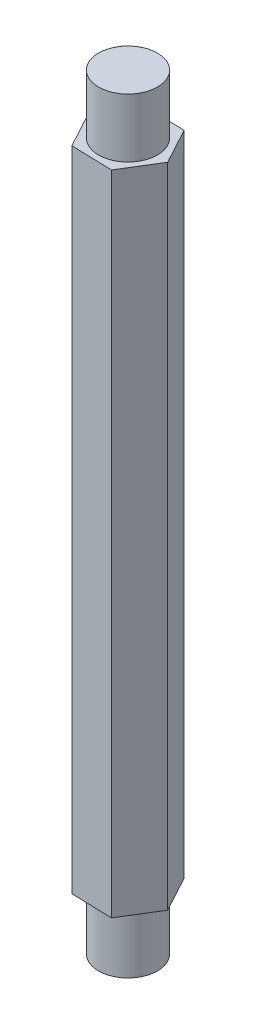
ISO-10303-21;
HEADER;
FILE_DESCRIPTION(('STEP AP214'),'2;1');
FILE_NAME('part.step','',(''),(''),'','','');
FILE_SCHEMA(('AUTOMOTIVE_DESIGN { 1 0 10303 214 1 1 1 1 }'));
ENDSEC;
DATA;
#1=APPLICATION_CONTEXT('core data for automotive mechanical design processes');
#2=APPLICATION_PROTOCOL_DEFINITION('international standard','automotive_design',2000,#1);
#3=PRODUCT_CONTEXT('',#1,'mechanical');
#4=PRODUCT('Part','Part','',(#3));
#5=PRODUCT_RELATED_PRODUCT_CATEGORY('part','',(#4));
#6=PRODUCT_DEFINITION_FORMATION('','',#4);
#7=PRODUCT_DEFINITION_CONTEXT('part definition',#1,'design');
#8=PRODUCT_DEFINITION('design','',#6,#7);
#9=PRODUCT_DEFINITION_SHAPE('','',#8);
#10=(LENGTH_UNIT() NAMED_UNIT(*) SI_UNIT(.MILLI.,.METRE.));
#11=(NAMED_UNIT(*) PLANE_ANGLE_UNIT() SI_UNIT($,.RADIAN.));
#12=(NAMED_UNIT(*) SI_UNIT($,.STERADIAN.) SOLID_ANGLE_UNIT());
#13=UNCERTAINTY_MEASURE_WITH_UNIT(LENGTH_MEASURE(1.E-05),#10,'distance_accuracy_value','');
#14=(GEOMETRIC_REPRESENTATION_CONTEXT(3) GLOBAL_UNCERTAINTY_ASSIGNED_CONTEXT((#13)) GLOBAL_UNIT_ASSIGNED_CONTEXT((#10,
#11,#12)) REPRESENTATION_CONTEXT('',''));
#15=CARTESIAN_POINT('',(0.,0.,0.));
#16=DIRECTION('',(0.,0.,1.));
#17=DIRECTION('',(1.,0.,0.));
#18=AXIS2_PLACEMENT_3D('',#15,#16,#17);
#19=CARTESIAN_POINT('',(0.,36.,0.));
#20=DIRECTION('',(0.,1.,0.));
#21=DIRECTION('',(0.,0.,1.));
#22=AXIS2_PLACEMENT_3D('',#19,#20,#21);
#23=PLANE('',#22);
#24=DIRECTION('',(-0.999619051100166,0.,-0.0275998673475779));
#25=VECTOR('',#24,1.);
#26=CARTESIAN_POINT('',(1.08851435205721,36.,-1.7706316684634));
#27=LINE('',#26,#25);
#28=CARTESIAN_POINT('',(1.08851435205721,36.,-1.7706316684634));
#29=VERTEX_POINT('',#28);
#30=CARTESIAN_POINT('',(-0.989154829605925,36.,-1.8279969154972));
#31=VERTEX_POINT('',#30);
#32=EDGE_CURVE('E131',#29,#31,#27,.T.);
#33=ORIENTED_EDGE('',*,*,#32,.T.);
#34=DIRECTION('',(-0.523711711814166,0.,0.85189555868585));
#35=VECTOR('',#34,1.);
#36=CARTESIAN_POINT('',(-0.989154829605925,36.,-1.8279969154972));
#37=LINE('',#36,#35);
#38=CARTESIAN_POINT('',(-2.07766918166313,36.,-0.0573652470337996));
#39=VERTEX_POINT('',#38);
#40=EDGE_CURVE('E89',#31,#39,#37,.T.);
#41=ORIENTED_EDGE('',*,*,#40,.T.);
#42=DIRECTION('',(0.475907339286,0.,0.879495426033427));
#43=VECTOR('',#42,1.);
#44=CARTESIAN_POINT('',(-2.07766918166313,36.,-0.0573652470337996));
#45=LINE('',#44,#43);
#46=CARTESIAN_POINT('',(-1.0885143520572,36.,1.7706316684634));
#47=VERTEX_POINT('',#46);
#48=EDGE_CURVE('E102',#39,#47,#45,.T.);
#49=ORIENTED_EDGE('',*,*,#48,.T.);
#50=DIRECTION('',(0.999619051100166,0.,0.0275998673475778));
#51=VECTOR('',#50,1.);
#52=CARTESIAN_POINT('',(-1.0885143520572,36.,1.7706316684634));
#53=LINE('',#52,#51);
#54=CARTESIAN_POINT('',(0.989154829605927,36.,1.8279969154972));
#55=VERTEX_POINT('',#54);
#56=EDGE_CURVE('E96',#47,#55,#53,.T.);
#57=ORIENTED_EDGE('',*,*,#56,.T.);
#58=DIRECTION('',(0.523711711814166,0.,-0.85189555868585));
#59=VECTOR('',#58,1.);
#60=CARTESIAN_POINT('',(0.989154829605927,36.,1.8279969154972));
#61=LINE('',#60,#59);
#62=CARTESIAN_POINT('',(2.07766918166313,36.,0.0573652470337994));
#63=VERTEX_POINT('',#62);
#64=EDGE_CURVE('E100',#55,#63,#61,.T.);
#65=ORIENTED_EDGE('',*,*,#64,.T.);
#66=DIRECTION('',(-0.475907339286,0.,-0.879495426033427));
#67=VECTOR('',#66,1.);
#68=CARTESIAN_POINT('',(2.07766918166313,36.,0.0573652470337994));
#69=LINE('',#68,#67);
#70=EDGE_CURVE('E51',#63,#29,#69,.T.);
#71=ORIENTED_EDGE('',*,*,#70,.T.);
#72=EDGE_LOOP('',(#33,#41,#49,#57,#65,#71));
#73=FACE_BOUND('',#72,.T.);
#74=CARTESIAN_POINT('',(0.,36.,0.));
#75=DIRECTION('',(0.,1.,0.));
#76=DIRECTION('',(0.,0.,1.));
#77=AXIS2_PLACEMENT_3D('',#74,#75,#76);
#78=CIRCLE('',#77,1.5);
#79=CARTESIAN_POINT('',(0.,36.,1.5));
#80=VERTEX_POINT('',#79);
#81=EDGE_CURVE('E188',#80,#80,#78,.T.);
#82=ORIENTED_EDGE('',*,*,#81,.F.);
#83=EDGE_LOOP('',(#82));
#84=FACE_BOUND('',#83,.T.);
#85=ADVANCED_FACE('F34',(#73,#84),#23,.T.);
#86=CARTESIAN_POINT('',(0.,3.,0.));
#87=DIRECTION('',(0.,-1.,0.));
#88=DIRECTION('',(0.,0.,-1.));
#89=AXIS2_PLACEMENT_3D('',#86,#87,#88);
#90=CYLINDRICAL_SURFACE('',#89,1.5);
#91=CARTESIAN_POINT('',(0.,3.,0.));
#92=DIRECTION('',(0.,1.,0.));
#93=DIRECTION('',(0.,0.,1.));
#94=AXIS2_PLACEMENT_3D('',#91,#92,#93);
#95=CIRCLE('',#94,1.5);
#96=CARTESIAN_POINT('',(0.,3.,1.5));
#97=VERTEX_POINT('',#96);
#98=EDGE_CURVE('E11',#97,#97,#95,.T.);
#99=ORIENTED_EDGE('',*,*,#98,.F.);
#100=EDGE_LOOP('',(#99));
#101=FACE_BOUND('',#100,.T.);
#102=CARTESIAN_POINT('',(0.,0.,0.));
#103=DIRECTION('',(0.,1.,0.));
#104=DIRECTION('',(0.,0.,1.));
#105=AXIS2_PLACEMENT_3D('',#102,#103,#104);
#106=CIRCLE('',#105,1.5);
#107=CARTESIAN_POINT('',(0.,0.,1.5));
#108=VERTEX_POINT('',#107);
#109=EDGE_CURVE('E38',#108,#108,#106,.T.);
#110=ORIENTED_EDGE('',*,*,#109,.T.);
#111=EDGE_LOOP('',(#110));
#112=FACE_BOUND('',#111,.T.);
#113=ADVANCED_FACE('F36',(#101,#112),#90,.T.);
#114=CARTESIAN_POINT('',(0.,0.,0.));
#115=DIRECTION('',(0.,1.,0.));
#116=DIRECTION('',(0.,0.,1.));
#117=AXIS2_PLACEMENT_3D('',#114,#115,#116);
#118=PLANE('',#117);
#119=ORIENTED_EDGE('',*,*,#109,.F.);
#120=EDGE_LOOP('',(#119));
#121=FACE_BOUND('',#120,.T.);
#122=ADVANCED_FACE('F144',(#121),#118,.F.);
#123=CARTESIAN_POINT('',(0.,3.,0.));
#124=DIRECTION('',(0.,1.,0.));
#125=DIRECTION('',(0.,0.,1.));
#126=AXIS2_PLACEMENT_3D('',#123,#124,#125);
#127=PLANE('',#126);
#128=DIRECTION('',(-0.999619051100166,0.,-0.0275998673475779));
#129=VECTOR('',#128,1.);
#130=CARTESIAN_POINT('',(1.08851435205721,3.,-1.7706316684634));
#131=LINE('',#130,#129);
#132=CARTESIAN_POINT('',(1.08851435205721,3.,-1.7706316684634));
#133=VERTEX_POINT('',#132);
#134=CARTESIAN_POINT('',(-0.989154829605925,3.,-1.8279969154972));
#135=VERTEX_POINT('',#134);
#136=EDGE_CURVE('E120',#133,#135,#131,.T.);
#137=ORIENTED_EDGE('',*,*,#136,.F.);
#138=DIRECTION('',(-0.475907339286,0.,-0.879495426033427));
#139=VECTOR('',#138,1.);
#140=CARTESIAN_POINT('',(2.07766918166313,3.,0.0573652470337994));
#141=LINE('',#140,#139);
#142=CARTESIAN_POINT('',(2.07766918166313,3.,0.0573652470337994));
#143=VERTEX_POINT('',#142);
#144=EDGE_CURVE('E80',#143,#133,#141,.T.);
#145=ORIENTED_EDGE('',*,*,#144,.F.);
#146=DIRECTION('',(0.523711711814166,0.,-0.85189555868585));
#147=VECTOR('',#146,1.);
#148=CARTESIAN_POINT('',(0.989154829605927,3.,1.8279969154972));
#149=LINE('',#148,#147);
#150=CARTESIAN_POINT('',(0.989154829605927,3.,1.8279969154972));
#151=VERTEX_POINT('',#150);
#152=EDGE_CURVE('E74',#151,#143,#149,.T.);
#153=ORIENTED_EDGE('',*,*,#152,.F.);
#154=DIRECTION('',(0.999619051100166,0.,0.0275998673475778));
#155=VECTOR('',#154,1.);
#156=CARTESIAN_POINT('',(-1.0885143520572,3.,1.7706316684634));
#157=LINE('',#156,#155);
#158=CARTESIAN_POINT('',(-1.0885143520572,3.,1.7706316684634));
#159=VERTEX_POINT('',#158);
#160=EDGE_CURVE('E110',#159,#151,#157,.T.);
#161=ORIENTED_EDGE('',*,*,#160,.F.);
#162=DIRECTION('',(0.475907339286,0.,0.879495426033427));
#163=VECTOR('',#162,1.);
#164=CARTESIAN_POINT('',(-2.07766918166313,3.,-0.0573652470337996));
#165=LINE('',#164,#163);
#166=CARTESIAN_POINT('',(-2.07766918166313,3.,-0.0573652470337996));
#167=VERTEX_POINT('',#166);
#168=EDGE_CURVE('E126',#167,#159,#165,.T.);
#169=ORIENTED_EDGE('',*,*,#168,.F.);
#170=DIRECTION('',(-0.523711711814166,0.,0.85189555868585));
#171=VECTOR('',#170,1.);
#172=CARTESIAN_POINT('',(-0.989154829605925,3.,-1.8279969154972));
#173=LINE('',#172,#171);
#174=EDGE_CURVE('E123',#135,#167,#173,.T.);
#175=ORIENTED_EDGE('',*,*,#174,.F.);
#176=EDGE_LOOP('',(#137,#145,#153,#161,#169,#175));
#177=FACE_BOUND('',#176,.T.);
#178=ORIENTED_EDGE('',*,*,#98,.T.);
#179=EDGE_LOOP('',(#178));
#180=FACE_BOUND('',#179,.T.);
#181=ADVANCED_FACE('F146',(#177,#180),#127,.F.);
#182=CARTESIAN_POINT('',(1.08851435205721,36.,-1.7706316684634));
#183=DIRECTION('',(-0.0275998673475779,0.,0.999619051100166));
#184=DIRECTION('',(0.999619051100166,0.,0.0275998673475779));
#185=AXIS2_PLACEMENT_3D('',#182,#183,#184);
#186=PLANE('',#185);
#187=ORIENTED_EDGE('',*,*,#136,.T.);
#188=DIRECTION('',(0.,-1.,0.));
#189=VECTOR('',#188,1.);
#190=CARTESIAN_POINT('',(-0.989154829605925,36.,-1.8279969154972));
#191=LINE('',#190,#189);
#192=EDGE_CURVE('E138',#31,#135,#191,.T.);
#193=ORIENTED_EDGE('',*,*,#192,.F.);
#194=ORIENTED_EDGE('',*,*,#32,.F.);
#195=DIRECTION('',(0.,-1.,0.));
#196=VECTOR('',#195,1.);
#197=CARTESIAN_POINT('',(1.08851435205721,36.,-1.7706316684634));
#198=LINE('',#197,#196);
#199=EDGE_CURVE('E116',#29,#133,#198,.T.);
#200=ORIENTED_EDGE('',*,*,#199,.T.);
#201=EDGE_LOOP('',(#187,#193,#194,#200));
#202=FACE_BOUND('',#201,.T.);
#203=ADVANCED_FACE('F151',(#202),#186,.F.);
#204=CARTESIAN_POINT('',(-0.989154829605925,36.,-1.8279969154972));
#205=DIRECTION('',(0.85189555868585,0.,0.523711711814166));
#206=DIRECTION('',(0.523711711814166,0.,-0.85189555868585));
#207=AXIS2_PLACEMENT_3D('',#204,#205,#206);
#208=PLANE('',#207);
#209=ORIENTED_EDGE('',*,*,#174,.T.);
#210=DIRECTION('',(0.,-1.,0.));
#211=VECTOR('',#210,1.);
#212=CARTESIAN_POINT('',(-2.07766918166313,36.,-0.0573652470337996));
#213=LINE('',#212,#211);
#214=EDGE_CURVE('E135',#39,#167,#213,.T.);
#215=ORIENTED_EDGE('',*,*,#214,.F.);
#216=ORIENTED_EDGE('',*,*,#40,.F.);
#217=ORIENTED_EDGE('',*,*,#192,.T.);
#218=EDGE_LOOP('',(#209,#215,#216,#217));
#219=FACE_BOUND('',#218,.T.);
#220=ADVANCED_FACE('F174',(#219),#208,.F.);
#221=CARTESIAN_POINT('',(-2.07766918166313,36.,-0.0573652470337996));
#222=DIRECTION('',(0.879495426033427,0.,-0.475907339286));
#223=DIRECTION('',(-0.475907339286,0.,-0.879495426033428));
#224=AXIS2_PLACEMENT_3D('',#221,#222,#223);
#225=PLANE('',#224);
#226=ORIENTED_EDGE('',*,*,#168,.T.);
#227=DIRECTION('',(0.,-1.,0.));
#228=VECTOR('',#227,1.);
#229=CARTESIAN_POINT('',(-1.0885143520572,36.,1.7706316684634));
#230=LINE('',#229,#228);
#231=EDGE_CURVE('E111',#47,#159,#230,.T.);
#232=ORIENTED_EDGE('',*,*,#231,.F.);
#233=ORIENTED_EDGE('',*,*,#48,.F.);
#234=ORIENTED_EDGE('',*,*,#214,.T.);
#235=EDGE_LOOP('',(#226,#232,#233,#234));
#236=FACE_BOUND('',#235,.T.);
#237=ADVANCED_FACE('F171',(#236),#225,.F.);
#238=CARTESIAN_POINT('',(-1.0885143520572,36.,1.7706316684634));
#239=DIRECTION('',(0.0275998673475778,0.,-0.999619051100166));
#240=DIRECTION('',(-0.999619051100166,0.,-0.0275998673475778));
#241=AXIS2_PLACEMENT_3D('',#238,#239,#240);
#242=PLANE('',#241);
#243=ORIENTED_EDGE('',*,*,#160,.T.);
#244=DIRECTION('',(0.,-1.,0.));
#245=VECTOR('',#244,1.);
#246=CARTESIAN_POINT('',(0.989154829605927,36.,1.8279969154972));
#247=LINE('',#246,#245);
#248=EDGE_CURVE('E107',#55,#151,#247,.T.);
#249=ORIENTED_EDGE('',*,*,#248,.F.);
#250=ORIENTED_EDGE('',*,*,#56,.F.);
#251=ORIENTED_EDGE('',*,*,#231,.T.);
#252=EDGE_LOOP('',(#243,#249,#250,#251));
#253=FACE_BOUND('',#252,.T.);
#254=ADVANCED_FACE('F108',(#253),#242,.F.);
#255=CARTESIAN_POINT('',(0.989154829605927,36.,1.8279969154972));
#256=DIRECTION('',(-0.85189555868585,0.,-0.523711711814166));
#257=DIRECTION('',(-0.523711711814166,0.,0.85189555868585));
#258=AXIS2_PLACEMENT_3D('',#255,#256,#257);
#259=PLANE('',#258);
#260=ORIENTED_EDGE('',*,*,#152,.T.);
#261=DIRECTION('',(0.,-1.,0.));
#262=VECTOR('',#261,1.);
#263=CARTESIAN_POINT('',(2.07766918166313,36.,0.0573652470337994));
#264=LINE('',#263,#262);
#265=EDGE_CURVE('E112',#63,#143,#264,.T.);
#266=ORIENTED_EDGE('',*,*,#265,.F.);
#267=ORIENTED_EDGE('',*,*,#64,.F.);
#268=ORIENTED_EDGE('',*,*,#248,.T.);
#269=EDGE_LOOP('',(#260,#266,#267,#268));
#270=FACE_BOUND('',#269,.T.);
#271=ADVANCED_FACE('F114',(#270),#259,.F.);
#272=CARTESIAN_POINT('',(2.07766918166313,36.,0.0573652470337994));
#273=DIRECTION('',(-0.879495426033427,0.,0.475907339286));
#274=DIRECTION('',(0.475907339286,0.,0.879495426033428));
#275=AXIS2_PLACEMENT_3D('',#272,#273,#274);
#276=PLANE('',#275);
#277=ORIENTED_EDGE('',*,*,#144,.T.);
#278=ORIENTED_EDGE('',*,*,#199,.F.);
#279=ORIENTED_EDGE('',*,*,#70,.F.);
#280=ORIENTED_EDGE('',*,*,#265,.T.);
#281=EDGE_LOOP('',(#277,#278,#279,#280));
#282=FACE_BOUND('',#281,.T.);
#283=ADVANCED_FACE('F164',(#282),#276,.F.);
#284=CARTESIAN_POINT('',(0.,39.,0.));
#285=DIRECTION('',(0.,-1.,0.));
#286=DIRECTION('',(0.,0.,-1.));
#287=AXIS2_PLACEMENT_3D('',#284,#285,#286);
#288=CYLINDRICAL_SURFACE('',#287,1.5);
#289=CARTESIAN_POINT('',(0.,39.,0.));
#290=DIRECTION('',(0.,1.,0.));
#291=DIRECTION('',(0.,0.,1.));
#292=AXIS2_PLACEMENT_3D('',#289,#290,#291);
#293=CIRCLE('',#292,1.5);
#294=CARTESIAN_POINT('',(0.,39.,1.5));
#295=VERTEX_POINT('',#294);
#296=EDGE_CURVE('E124',#295,#295,#293,.T.);
#297=ORIENTED_EDGE('',*,*,#296,.F.);
#298=EDGE_LOOP('',(#297));
#299=FACE_BOUND('',#298,.T.);
#300=ORIENTED_EDGE('',*,*,#81,.T.);
#301=EDGE_LOOP('',(#300));
#302=FACE_BOUND('',#301,.T.);
#303=ADVANCED_FACE('F161',(#299,#302),#288,.T.);
#304=CARTESIAN_POINT('',(0.,39.,0.));
#305=DIRECTION('',(0.,1.,0.));
#306=DIRECTION('',(0.,0.,1.));
#307=AXIS2_PLACEMENT_3D('',#304,#305,#306);
#308=PLANE('',#307);
#309=ORIENTED_EDGE('',*,*,#296,.T.);
#310=EDGE_LOOP('',(#309));
#311=FACE_BOUND('',#310,.T.);
#312=ADVANCED_FACE('F194',(#311),#308,.T.);
#313=CLOSED_SHELL('',(#85,#113,#122,#181,#203,#220,#237,#254,#271,#283,#303,#312));
#314=MANIFOLD_SOLID_BREP('B2',#313);
#315=ADVANCED_BREP_SHAPE_REPRESENTATION('',(#18,#314),#14);
#316=SHAPE_DEFINITION_REPRESENTATION(#9,#315);
ENDSEC;
END-ISO-10303-21;
